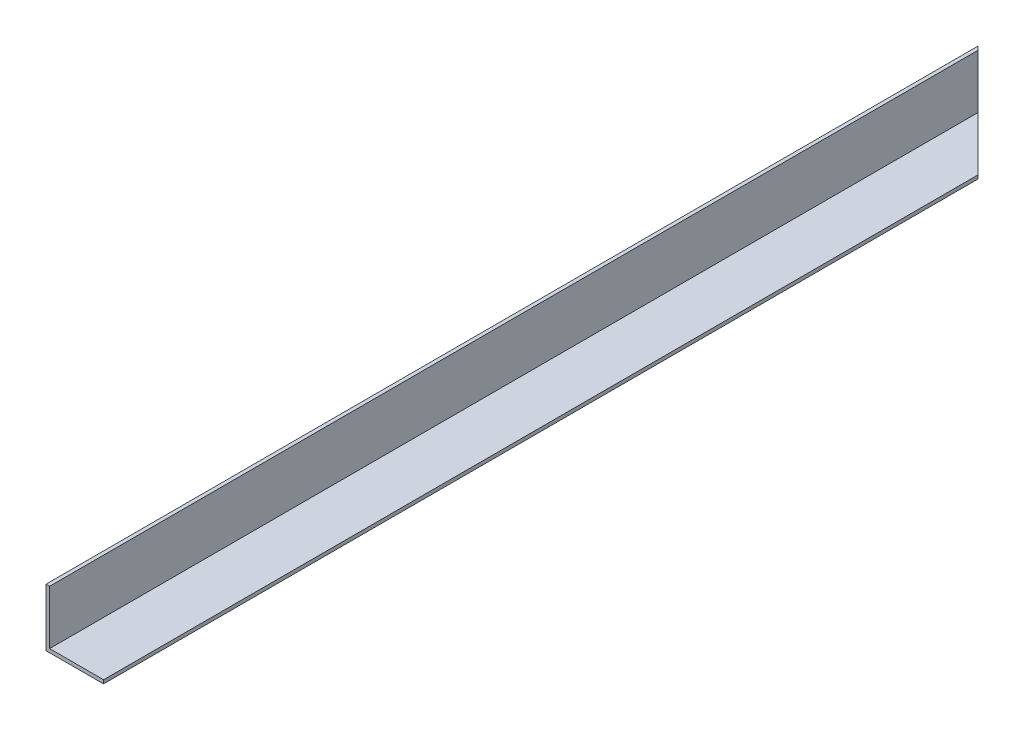
ISO-10303-21;
HEADER;
FILE_DESCRIPTION(('STEP AP214'),'2;1');
FILE_NAME('part.step','',(''),(''),'','','');
FILE_SCHEMA(('AUTOMOTIVE_DESIGN { 1 0 10303 214 1 1 1 1 }'));
ENDSEC;
DATA;
#1=APPLICATION_CONTEXT('core data for automotive mechanical design processes');
#2=APPLICATION_PROTOCOL_DEFINITION('international standard','automotive_design',2000,#1);
#3=PRODUCT_CONTEXT('',#1,'mechanical');
#4=PRODUCT('Part','Part','',(#3));
#5=PRODUCT_RELATED_PRODUCT_CATEGORY('part','',(#4));
#6=PRODUCT_DEFINITION_FORMATION('','',#4);
#7=PRODUCT_DEFINITION_CONTEXT('part definition',#1,'design');
#8=PRODUCT_DEFINITION('design','',#6,#7);
#9=PRODUCT_DEFINITION_SHAPE('','',#8);
#10=(LENGTH_UNIT() NAMED_UNIT(*) SI_UNIT(.MILLI.,.METRE.));
#11=(NAMED_UNIT(*) PLANE_ANGLE_UNIT() SI_UNIT($,.RADIAN.));
#12=(NAMED_UNIT(*) SI_UNIT($,.STERADIAN.) SOLID_ANGLE_UNIT());
#13=UNCERTAINTY_MEASURE_WITH_UNIT(LENGTH_MEASURE(1.E-05),#10,'distance_accuracy_value','');
#14=(GEOMETRIC_REPRESENTATION_CONTEXT(3) GLOBAL_UNCERTAINTY_ASSIGNED_CONTEXT((#13)) GLOBAL_UNIT_ASSIGNED_CONTEXT((#10,
#11,#12)) REPRESENTATION_CONTEXT('',''));
#15=CARTESIAN_POINT('',(0.,0.,0.));
#16=DIRECTION('',(0.,0.,1.));
#17=DIRECTION('',(1.,0.,0.));
#18=AXIS2_PLACEMENT_3D('',#15,#16,#17);
#19=CARTESIAN_POINT('',(0.,-1.,259.));
#20=DIRECTION('',(0.,1.,0.));
#21=DIRECTION('',(0.,0.,1.));
#22=AXIS2_PLACEMENT_3D('',#19,#20,#21);
#23=PLANE('',#22);
#24=DIRECTION('',(0.,0.,-1.));
#25=VECTOR('',#24,1.);
#26=CARTESIAN_POINT('',(-1.,-1.,259.));
#27=LINE('',#26,#25);
#28=CARTESIAN_POINT('',(-1.,-1.,259.));
#29=VERTEX_POINT('',#28);
#30=CARTESIAN_POINT('',(-1.,-1.,0.));
#31=VERTEX_POINT('',#30);
#32=EDGE_CURVE('E103',#29,#31,#27,.T.);
#33=ORIENTED_EDGE('',*,*,#32,.T.);
#34=DIRECTION('',(-0.707106781186548,0.,-0.707106781186548));
#35=VECTOR('',#34,1.);
#36=CARTESIAN_POINT('',(-1.,-1.,0.));
#37=LINE('',#36,#35);
#38=CARTESIAN_POINT('',(15.,-1.,16.));
#39=VERTEX_POINT('',#38);
#40=EDGE_CURVE('E87',#39,#31,#37,.T.);
#41=ORIENTED_EDGE('',*,*,#40,.F.);
#42=DIRECTION('',(0.,0.,-1.));
#43=VECTOR('',#42,1.);
#44=CARTESIAN_POINT('',(15.,-1.,259.));
#45=LINE('',#44,#43);
#46=CARTESIAN_POINT('',(15.,-1.,259.));
#47=VERTEX_POINT('',#46);
#48=EDGE_CURVE('E11',#47,#39,#45,.T.);
#49=ORIENTED_EDGE('',*,*,#48,.F.);
#50=DIRECTION('',(1.,0.,0.));
#51=VECTOR('',#50,1.);
#52=CARTESIAN_POINT('',(0.,-1.,259.));
#53=LINE('',#52,#51);
#54=EDGE_CURVE('E91',#29,#47,#53,.T.);
#55=ORIENTED_EDGE('',*,*,#54,.F.);
#56=EDGE_LOOP('',(#33,#41,#49,#55));
#57=FACE_BOUND('',#56,.T.);
#58=ADVANCED_FACE('F33',(#57),#23,.F.);
#59=CARTESIAN_POINT('',(15.,0.,259.));
#60=DIRECTION('',(1.,0.,0.));
#61=DIRECTION('',(0.,0.,-1.));
#62=AXIS2_PLACEMENT_3D('',#59,#60,#61);
#63=PLANE('',#62);
#64=DIRECTION('',(0.,-1.,0.));
#65=VECTOR('',#64,1.);
#66=CARTESIAN_POINT('',(15.,15.,16.));
#67=LINE('',#66,#65);
#68=CARTESIAN_POINT('',(15.,0.,16.));
#69=VERTEX_POINT('',#68);
#70=EDGE_CURVE('E100',#69,#39,#67,.T.);
#71=ORIENTED_EDGE('',*,*,#70,.F.);
#72=DIRECTION('',(0.,0.,-1.));
#73=VECTOR('',#72,1.);
#74=CARTESIAN_POINT('',(15.,0.,259.));
#75=LINE('',#74,#73);
#76=CARTESIAN_POINT('',(15.,0.,259.));
#77=VERTEX_POINT('',#76);
#78=EDGE_CURVE('E41',#77,#69,#75,.T.);
#79=ORIENTED_EDGE('',*,*,#78,.F.);
#80=DIRECTION('',(0.,-1.,0.));
#81=VECTOR('',#80,1.);
#82=CARTESIAN_POINT('',(15.,0.,259.));
#83=LINE('',#82,#81);
#84=EDGE_CURVE('E122',#77,#47,#83,.T.);
#85=ORIENTED_EDGE('',*,*,#84,.T.);
#86=ORIENTED_EDGE('',*,*,#48,.T.);
#87=EDGE_LOOP('',(#71,#79,#85,#86));
#88=FACE_BOUND('',#87,.T.);
#89=ADVANCED_FACE('F121',(#88),#63,.T.);
#90=CARTESIAN_POINT('',(0.,0.,259.));
#91=DIRECTION('',(0.,1.,0.));
#92=DIRECTION('',(0.,0.,1.));
#93=AXIS2_PLACEMENT_3D('',#90,#91,#92);
#94=PLANE('',#93);
#95=DIRECTION('',(0.707106781186548,0.,0.707106781186548));
#96=VECTOR('',#95,1.);
#97=CARTESIAN_POINT('',(129.,0.,130.));
#98=LINE('',#97,#96);
#99=CARTESIAN_POINT('',(0.,0.,1.));
#100=VERTEX_POINT('',#99);
#101=EDGE_CURVE('E92',#100,#69,#98,.T.);
#102=ORIENTED_EDGE('',*,*,#101,.F.);
#103=DIRECTION('',(0.,0.,-1.));
#104=VECTOR('',#103,1.);
#105=CARTESIAN_POINT('',(0.,0.,259.));
#106=LINE('',#105,#104);
#107=CARTESIAN_POINT('',(0.,0.,259.));
#108=VERTEX_POINT('',#107);
#109=EDGE_CURVE('E105',#108,#100,#106,.T.);
#110=ORIENTED_EDGE('',*,*,#109,.F.);
#111=DIRECTION('',(1.,0.,0.));
#112=VECTOR('',#111,1.);
#113=CARTESIAN_POINT('',(0.,0.,259.));
#114=LINE('',#113,#112);
#115=EDGE_CURVE('E116',#108,#77,#114,.T.);
#116=ORIENTED_EDGE('',*,*,#115,.T.);
#117=ORIENTED_EDGE('',*,*,#78,.T.);
#118=EDGE_LOOP('',(#102,#110,#116,#117));
#119=FACE_BOUND('',#118,.T.);
#120=ADVANCED_FACE('F114',(#119),#94,.T.);
#121=CARTESIAN_POINT('',(0.,0.,259.));
#122=DIRECTION('',(1.,0.,0.));
#123=DIRECTION('',(0.,0.,-1.));
#124=AXIS2_PLACEMENT_3D('',#121,#122,#123);
#125=PLANE('',#124);
#126=DIRECTION('',(0.,-1.,0.));
#127=VECTOR('',#126,1.);
#128=CARTESIAN_POINT('',(0.,0.,1.));
#129=LINE('',#128,#127);
#130=CARTESIAN_POINT('',(0.,15.,1.));
#131=VERTEX_POINT('',#130);
#132=EDGE_CURVE('E139',#131,#100,#129,.T.);
#133=ORIENTED_EDGE('',*,*,#132,.F.);
#134=DIRECTION('',(0.,0.,-1.));
#135=VECTOR('',#134,1.);
#136=CARTESIAN_POINT('',(0.,15.,259.));
#137=LINE('',#136,#135);
#138=CARTESIAN_POINT('',(0.,15.,259.));
#139=VERTEX_POINT('',#138);
#140=EDGE_CURVE('E99',#139,#131,#137,.T.);
#141=ORIENTED_EDGE('',*,*,#140,.F.);
#142=DIRECTION('',(0.,-1.,0.));
#143=VECTOR('',#142,1.);
#144=CARTESIAN_POINT('',(0.,0.,259.));
#145=LINE('',#144,#143);
#146=EDGE_CURVE('E129',#139,#108,#145,.T.);
#147=ORIENTED_EDGE('',*,*,#146,.T.);
#148=ORIENTED_EDGE('',*,*,#109,.T.);
#149=EDGE_LOOP('',(#133,#141,#147,#148));
#150=FACE_BOUND('',#149,.T.);
#151=ADVANCED_FACE('F138',(#150),#125,.T.);
#152=CARTESIAN_POINT('',(-1.,15.,259.));
#153=DIRECTION('',(0.,1.,0.));
#154=DIRECTION('',(0.,0.,1.));
#155=AXIS2_PLACEMENT_3D('',#152,#153,#154);
#156=PLANE('',#155);
#157=DIRECTION('',(-0.707106781186548,0.,-0.707106781186548));
#158=VECTOR('',#157,1.);
#159=CARTESIAN_POINT('',(-1.,15.,0.));
#160=LINE('',#159,#158);
#161=CARTESIAN_POINT('',(-1.,15.,0.));
#162=VERTEX_POINT('',#161);
#163=EDGE_CURVE('E84',#131,#162,#160,.T.);
#164=ORIENTED_EDGE('',*,*,#163,.T.);
#165=DIRECTION('',(0.,0.,-1.));
#166=VECTOR('',#165,1.);
#167=CARTESIAN_POINT('',(-1.,15.,259.));
#168=LINE('',#167,#166);
#169=CARTESIAN_POINT('',(-1.,15.,259.));
#170=VERTEX_POINT('',#169);
#171=EDGE_CURVE('E98',#170,#162,#168,.T.);
#172=ORIENTED_EDGE('',*,*,#171,.F.);
#173=DIRECTION('',(1.,0.,0.));
#174=VECTOR('',#173,1.);
#175=CARTESIAN_POINT('',(-1.,15.,259.));
#176=LINE('',#175,#174);
#177=EDGE_CURVE('E135',#170,#139,#176,.T.);
#178=ORIENTED_EDGE('',*,*,#177,.T.);
#179=ORIENTED_EDGE('',*,*,#140,.T.);
#180=EDGE_LOOP('',(#164,#172,#178,#179));
#181=FACE_BOUND('',#180,.T.);
#182=ADVANCED_FACE('F96',(#181),#156,.T.);
#183=CARTESIAN_POINT('',(-1.,0.,259.));
#184=DIRECTION('',(1.,0.,0.));
#185=DIRECTION('',(0.,0.,-1.));
#186=AXIS2_PLACEMENT_3D('',#183,#184,#185);
#187=PLANE('',#186);
#188=DIRECTION('',(0.,1.,0.));
#189=VECTOR('',#188,1.);
#190=CARTESIAN_POINT('',(-1.,0.,0.));
#191=LINE('',#190,#189);
#192=EDGE_CURVE('E81',#162,#31,#191,.F.);
#193=ORIENTED_EDGE('',*,*,#192,.T.);
#194=ORIENTED_EDGE('',*,*,#32,.F.);
#195=DIRECTION('',(0.,1.,0.));
#196=VECTOR('',#195,1.);
#197=CARTESIAN_POINT('',(-1.,0.,259.));
#198=LINE('',#197,#196);
#199=EDGE_CURVE('E48',#170,#29,#198,.F.);
#200=ORIENTED_EDGE('',*,*,#199,.F.);
#201=ORIENTED_EDGE('',*,*,#171,.T.);
#202=EDGE_LOOP('',(#193,#194,#200,#201));
#203=FACE_BOUND('',#202,.T.);
#204=ADVANCED_FACE('F102',(#203),#187,.F.);
#205=CARTESIAN_POINT('',(0.,0.,259.));
#206=DIRECTION('',(0.,0.,-1.));
#207=DIRECTION('',(-1.,0.,0.));
#208=AXIS2_PLACEMENT_3D('',#205,#206,#207);
#209=PLANE('',#208);
#210=ORIENTED_EDGE('',*,*,#54,.T.);
#211=ORIENTED_EDGE('',*,*,#84,.F.);
#212=ORIENTED_EDGE('',*,*,#115,.F.);
#213=ORIENTED_EDGE('',*,*,#146,.F.);
#214=ORIENTED_EDGE('',*,*,#177,.F.);
#215=ORIENTED_EDGE('',*,*,#199,.T.);
#216=EDGE_LOOP('',(#210,#211,#212,#213,#214,#215));
#217=FACE_BOUND('',#216,.T.);
#218=ADVANCED_FACE('F123',(#217),#209,.F.);
#219=CARTESIAN_POINT('',(-1.,15.,0.));
#220=DIRECTION('',(-0.707106781186547,0.,0.707106781186547));
#221=DIRECTION('',(0.707106781186548,0.,0.707106781186548));
#222=AXIS2_PLACEMENT_3D('',#219,#220,#221);
#223=PLANE('',#222);
#224=ORIENTED_EDGE('',*,*,#101,.T.);
#225=ORIENTED_EDGE('',*,*,#70,.T.);
#226=ORIENTED_EDGE('',*,*,#40,.T.);
#227=ORIENTED_EDGE('',*,*,#192,.F.);
#228=ORIENTED_EDGE('',*,*,#163,.F.);
#229=ORIENTED_EDGE('',*,*,#132,.T.);
#230=EDGE_LOOP('',(#224,#225,#226,#227,#228,#229));
#231=FACE_BOUND('',#230,.T.);
#232=ADVANCED_FACE('F83',(#231),#223,.F.);
#233=CLOSED_SHELL('',(#58,#89,#120,#151,#182,#204,#218,#232));
#234=MANIFOLD_SOLID_BREP('B2',#233);
#235=ADVANCED_BREP_SHAPE_REPRESENTATION('',(#18,#234),#14);
#236=SHAPE_DEFINITION_REPRESENTATION(#9,#235);
ENDSEC;
END-ISO-10303-21;
